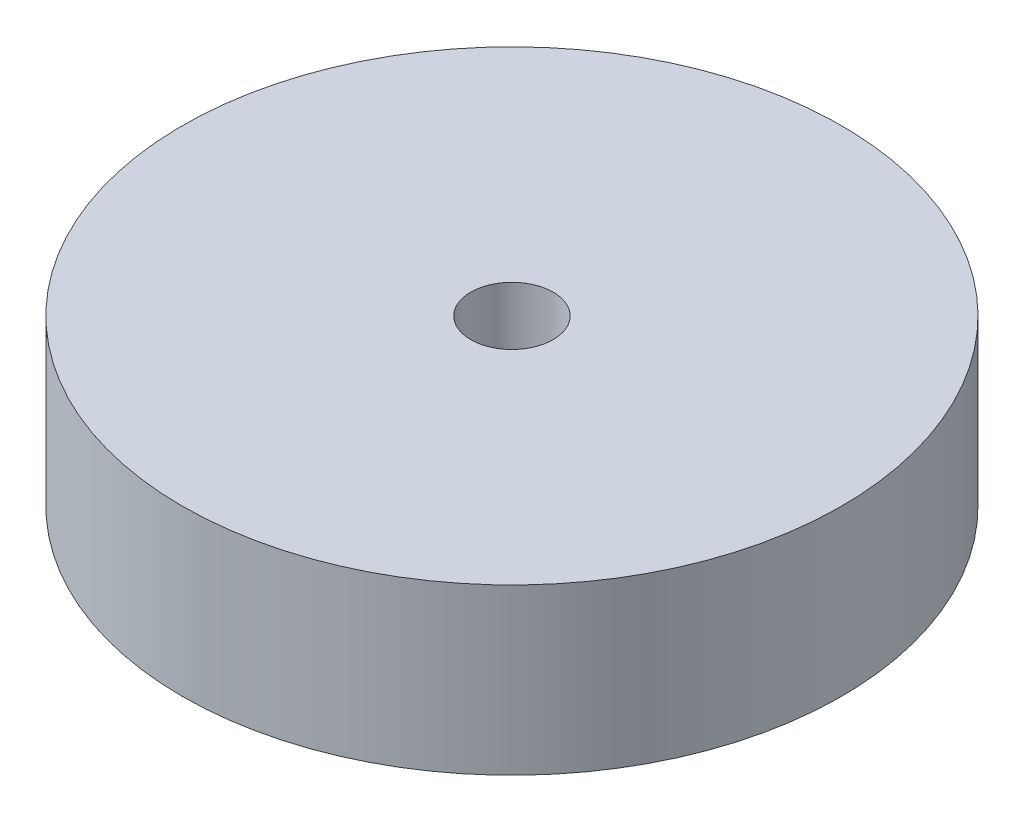
ISO-10303-21;
HEADER;
FILE_DESCRIPTION(('STEP AP214'),'2;1');
FILE_NAME('part.step','',(''),(''),'','','');
FILE_SCHEMA(('AUTOMOTIVE_DESIGN { 1 0 10303 214 1 1 1 1 }'));
ENDSEC;
DATA;
#1=APPLICATION_CONTEXT('core data for automotive mechanical design processes');
#2=APPLICATION_PROTOCOL_DEFINITION('international standard','automotive_design',2000,#1);
#3=PRODUCT_CONTEXT('',#1,'mechanical');
#4=PRODUCT('Part','Part','',(#3));
#5=PRODUCT_RELATED_PRODUCT_CATEGORY('part','',(#4));
#6=PRODUCT_DEFINITION_FORMATION('','',#4);
#7=PRODUCT_DEFINITION_CONTEXT('part definition',#1,'design');
#8=PRODUCT_DEFINITION('design','',#6,#7);
#9=PRODUCT_DEFINITION_SHAPE('','',#8);
#10=(LENGTH_UNIT() NAMED_UNIT(*) SI_UNIT(.MILLI.,.METRE.));
#11=(NAMED_UNIT(*) PLANE_ANGLE_UNIT() SI_UNIT($,.RADIAN.));
#12=(NAMED_UNIT(*) SI_UNIT($,.STERADIAN.) SOLID_ANGLE_UNIT());
#13=UNCERTAINTY_MEASURE_WITH_UNIT(LENGTH_MEASURE(1.E-05),#10,'distance_accuracy_value','');
#14=(GEOMETRIC_REPRESENTATION_CONTEXT(3) GLOBAL_UNCERTAINTY_ASSIGNED_CONTEXT((#13)) GLOBAL_UNIT_ASSIGNED_CONTEXT((#10,
#11,#12)) REPRESENTATION_CONTEXT('',''));
#15=CARTESIAN_POINT('',(0.,0.,0.));
#16=DIRECTION('',(0.,0.,1.));
#17=DIRECTION('',(1.,0.,0.));
#18=AXIS2_PLACEMENT_3D('',#15,#16,#17);
#19=CARTESIAN_POINT('',(0.,1.5875,0.));
#20=DIRECTION('',(0.,1.,0.));
#21=DIRECTION('',(0.,0.,1.));
#22=AXIS2_PLACEMENT_3D('',#19,#20,#21);
#23=PLANE('',#22);
#24=CARTESIAN_POINT('',(0.,1.5875,0.));
#25=DIRECTION('',(0.,1.,0.));
#26=DIRECTION('',(0.,0.,1.));
#27=AXIS2_PLACEMENT_3D('',#24,#25,#26);
#28=CIRCLE('',#27,3.175);
#29=CARTESIAN_POINT('',(0.,1.5875,3.175));
#30=VERTEX_POINT('',#29);
#31=EDGE_CURVE('E10',#30,#30,#28,.T.);
#32=ORIENTED_EDGE('',*,*,#31,.T.);
#33=EDGE_LOOP('',(#32));
#34=FACE_BOUND('',#33,.T.);
#35=CARTESIAN_POINT('',(0.,1.5875,0.));
#36=DIRECTION('',(0.,1.,0.));
#37=DIRECTION('',(0.,0.,1.));
#38=AXIS2_PLACEMENT_3D('',#35,#36,#37);
#39=CIRCLE('',#38,0.396875);
#40=CARTESIAN_POINT('',(0.,1.5875,0.396875));
#41=VERTEX_POINT('',#40);
#42=EDGE_CURVE('E42',#41,#41,#39,.T.);
#43=ORIENTED_EDGE('',*,*,#42,.F.);
#44=EDGE_LOOP('',(#43));
#45=FACE_BOUND('',#44,.T.);
#46=ADVANCED_FACE('F31',(#34,#45),#23,.T.);
#47=CARTESIAN_POINT('',(0.,0.,0.));
#48=DIRECTION('',(0.,1.,0.));
#49=DIRECTION('',(0.,0.,1.));
#50=AXIS2_PLACEMENT_3D('',#47,#48,#49);
#51=PLANE('',#50);
#52=CARTESIAN_POINT('',(0.,0.,0.));
#53=DIRECTION('',(0.,1.,0.));
#54=DIRECTION('',(0.,0.,1.));
#55=AXIS2_PLACEMENT_3D('',#52,#53,#54);
#56=CIRCLE('',#55,3.175);
#57=CARTESIAN_POINT('',(0.,0.,3.175));
#58=VERTEX_POINT('',#57);
#59=EDGE_CURVE('E35',#58,#58,#56,.T.);
#60=ORIENTED_EDGE('',*,*,#59,.F.);
#61=EDGE_LOOP('',(#60));
#62=FACE_BOUND('',#61,.T.);
#63=CARTESIAN_POINT('',(0.,0.,0.));
#64=DIRECTION('',(0.,1.,0.));
#65=DIRECTION('',(0.,0.,1.));
#66=AXIS2_PLACEMENT_3D('',#63,#64,#65);
#67=CIRCLE('',#66,0.396875);
#68=CARTESIAN_POINT('',(0.,0.,0.396875));
#69=VERTEX_POINT('',#68);
#70=EDGE_CURVE('E44',#69,#69,#67,.T.);
#71=ORIENTED_EDGE('',*,*,#70,.T.);
#72=EDGE_LOOP('',(#71));
#73=FACE_BOUND('',#72,.T.);
#74=ADVANCED_FACE('F54',(#62,#73),#51,.F.);
#75=CARTESIAN_POINT('',(0.,1.5875,0.));
#76=DIRECTION('',(0.,-1.,0.));
#77=DIRECTION('',(0.,0.,-1.));
#78=AXIS2_PLACEMENT_3D('',#75,#76,#77);
#79=CYLINDRICAL_SURFACE('',#78,3.175);
#80=ORIENTED_EDGE('',*,*,#31,.F.);
#81=EDGE_LOOP('',(#80));
#82=FACE_BOUND('',#81,.T.);
#83=ORIENTED_EDGE('',*,*,#59,.T.);
#84=EDGE_LOOP('',(#83));
#85=FACE_BOUND('',#84,.T.);
#86=ADVANCED_FACE('F33',(#82,#85),#79,.T.);
#87=CARTESIAN_POINT('',(0.,1.5875,0.));
#88=DIRECTION('',(0.,-1.,0.));
#89=DIRECTION('',(0.,0.,-1.));
#90=AXIS2_PLACEMENT_3D('',#87,#88,#89);
#91=CYLINDRICAL_SURFACE('',#90,0.396875);
#92=ORIENTED_EDGE('',*,*,#42,.T.);
#93=EDGE_LOOP('',(#92));
#94=FACE_BOUND('',#93,.T.);
#95=ORIENTED_EDGE('',*,*,#70,.F.);
#96=EDGE_LOOP('',(#95));
#97=FACE_BOUND('',#96,.T.);
#98=ADVANCED_FACE('F50',(#94,#97),#91,.F.);
#99=CLOSED_SHELL('',(#46,#74,#86,#98));
#100=MANIFOLD_SOLID_BREP('B2',#99);
#101=ADVANCED_BREP_SHAPE_REPRESENTATION('',(#18,#100),#14);
#102=SHAPE_DEFINITION_REPRESENTATION(#9,#101);
ENDSEC;
END-ISO-10303-21;
